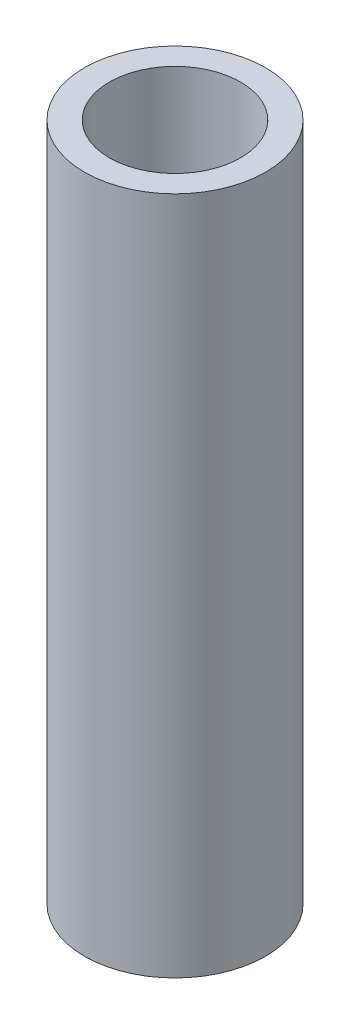
ISO-10303-21;
HEADER;
FILE_DESCRIPTION(('STEP AP214'),'2;1');
FILE_NAME('part.step','',(''),(''),'','','');
FILE_SCHEMA(('AUTOMOTIVE_DESIGN { 1 0 10303 214 1 1 1 1 }'));
ENDSEC;
DATA;
#1=APPLICATION_CONTEXT('core data for automotive mechanical design processes');
#2=APPLICATION_PROTOCOL_DEFINITION('international standard','automotive_design',2000,#1);
#3=PRODUCT_CONTEXT('',#1,'mechanical');
#4=PRODUCT('Part','Part','',(#3));
#5=PRODUCT_RELATED_PRODUCT_CATEGORY('part','',(#4));
#6=PRODUCT_DEFINITION_FORMATION('','',#4);
#7=PRODUCT_DEFINITION_CONTEXT('part definition',#1,'design');
#8=PRODUCT_DEFINITION('design','',#6,#7);
#9=PRODUCT_DEFINITION_SHAPE('','',#8);
#10=(LENGTH_UNIT() NAMED_UNIT(*) SI_UNIT(.MILLI.,.METRE.));
#11=(NAMED_UNIT(*) PLANE_ANGLE_UNIT() SI_UNIT($,.RADIAN.));
#12=(NAMED_UNIT(*) SI_UNIT($,.STERADIAN.) SOLID_ANGLE_UNIT());
#13=UNCERTAINTY_MEASURE_WITH_UNIT(LENGTH_MEASURE(1.E-05),#10,'distance_accuracy_value','');
#14=(GEOMETRIC_REPRESENTATION_CONTEXT(3) GLOBAL_UNCERTAINTY_ASSIGNED_CONTEXT((#13)) GLOBAL_UNIT_ASSIGNED_CONTEXT((#10,
#11,#12)) REPRESENTATION_CONTEXT('',''));
#15=CARTESIAN_POINT('',(0.,0.,0.));
#16=DIRECTION('',(0.,0.,1.));
#17=DIRECTION('',(1.,0.,0.));
#18=AXIS2_PLACEMENT_3D('',#15,#16,#17);
#19=CARTESIAN_POINT('',(0.,60.,0.));
#20=DIRECTION('',(0.,1.,0.));
#21=DIRECTION('',(0.,0.,1.));
#22=AXIS2_PLACEMENT_3D('',#19,#20,#21);
#23=PLANE('',#22);
#24=CARTESIAN_POINT('',(0.,60.,0.));
#25=DIRECTION('',(0.,1.,0.));
#26=DIRECTION('',(0.,0.,1.));
#27=AXIS2_PLACEMENT_3D('',#24,#25,#26);
#28=CIRCLE('',#27,8.);
#29=CARTESIAN_POINT('',(0.,60.,8.));
#30=VERTEX_POINT('',#29);
#31=EDGE_CURVE('E10',#30,#30,#28,.T.);
#32=ORIENTED_EDGE('',*,*,#31,.T.);
#33=EDGE_LOOP('',(#32));
#34=FACE_BOUND('',#33,.T.);
#35=CARTESIAN_POINT('',(0.,60.,0.));
#36=DIRECTION('',(0.,1.,0.));
#37=DIRECTION('',(0.,0.,1.));
#38=AXIS2_PLACEMENT_3D('',#35,#36,#37);
#39=CIRCLE('',#38,5.8);
#40=CARTESIAN_POINT('',(0.,60.,5.8));
#41=VERTEX_POINT('',#40);
#42=EDGE_CURVE('E44',#41,#41,#39,.T.);
#43=ORIENTED_EDGE('',*,*,#42,.F.);
#44=EDGE_LOOP('',(#43));
#45=FACE_BOUND('',#44,.T.);
#46=ADVANCED_FACE('F33',(#34,#45),#23,.T.);
#47=CARTESIAN_POINT('',(0.,0.,0.));
#48=DIRECTION('',(0.,1.,0.));
#49=DIRECTION('',(0.,0.,1.));
#50=AXIS2_PLACEMENT_3D('',#47,#48,#49);
#51=PLANE('',#50);
#52=CARTESIAN_POINT('',(0.,0.,0.));
#53=DIRECTION('',(0.,1.,0.));
#54=DIRECTION('',(0.,0.,1.));
#55=AXIS2_PLACEMENT_3D('',#52,#53,#54);
#56=CIRCLE('',#55,8.);
#57=CARTESIAN_POINT('',(0.,0.,8.));
#58=VERTEX_POINT('',#57);
#59=EDGE_CURVE('E37',#58,#58,#56,.T.);
#60=ORIENTED_EDGE('',*,*,#59,.F.);
#61=EDGE_LOOP('',(#60));
#62=FACE_BOUND('',#61,.T.);
#63=CARTESIAN_POINT('',(0.,0.,0.));
#64=DIRECTION('',(0.,1.,0.));
#65=DIRECTION('',(0.,0.,1.));
#66=AXIS2_PLACEMENT_3D('',#63,#64,#65);
#67=CIRCLE('',#66,5.8);
#68=CARTESIAN_POINT('',(0.,0.,5.8));
#69=VERTEX_POINT('',#68);
#70=EDGE_CURVE('E46',#69,#69,#67,.T.);
#71=ORIENTED_EDGE('',*,*,#70,.T.);
#72=EDGE_LOOP('',(#71));
#73=FACE_BOUND('',#72,.T.);
#74=ADVANCED_FACE('F56',(#62,#73),#51,.F.);
#75=CARTESIAN_POINT('',(0.,60.,0.));
#76=DIRECTION('',(0.,-1.,0.));
#77=DIRECTION('',(0.,0.,-1.));
#78=AXIS2_PLACEMENT_3D('',#75,#76,#77);
#79=CYLINDRICAL_SURFACE('',#78,8.);
#80=ORIENTED_EDGE('',*,*,#31,.F.);
#81=EDGE_LOOP('',(#80));
#82=FACE_BOUND('',#81,.T.);
#83=ORIENTED_EDGE('',*,*,#59,.T.);
#84=EDGE_LOOP('',(#83));
#85=FACE_BOUND('',#84,.T.);
#86=ADVANCED_FACE('F35',(#82,#85),#79,.T.);
#87=CARTESIAN_POINT('',(0.,60.,0.));
#88=DIRECTION('',(0.,-1.,0.));
#89=DIRECTION('',(0.,0.,-1.));
#90=AXIS2_PLACEMENT_3D('',#87,#88,#89);
#91=CYLINDRICAL_SURFACE('',#90,5.8);
#92=ORIENTED_EDGE('',*,*,#42,.T.);
#93=EDGE_LOOP('',(#92));
#94=FACE_BOUND('',#93,.T.);
#95=ORIENTED_EDGE('',*,*,#70,.F.);
#96=EDGE_LOOP('',(#95));
#97=FACE_BOUND('',#96,.T.);
#98=ADVANCED_FACE('F52',(#94,#97),#91,.F.);
#99=CLOSED_SHELL('',(#46,#74,#86,#98));
#100=MANIFOLD_SOLID_BREP('B2',#99);
#101=ADVANCED_BREP_SHAPE_REPRESENTATION('',(#18,#100),#14);
#102=SHAPE_DEFINITION_REPRESENTATION(#9,#101);
ENDSEC;
END-ISO-10303-21;
